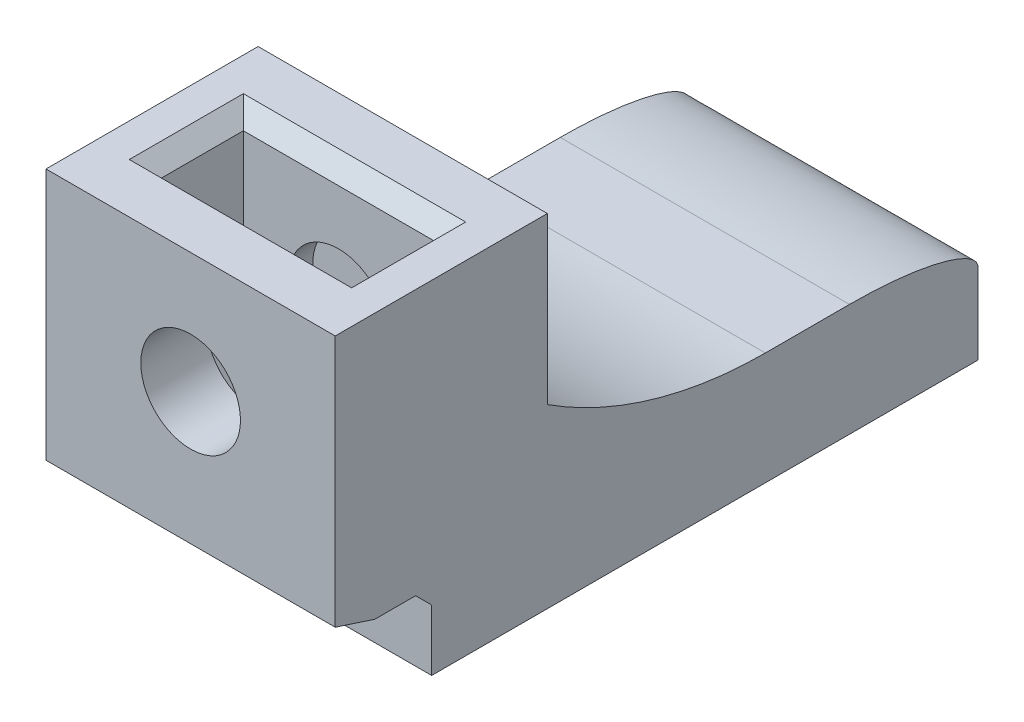
ISO-10303-21;
HEADER;
FILE_DESCRIPTION(('STEP AP214'),'2;1');
FILE_NAME('part.step','',(''),(''),'','','');
FILE_SCHEMA(('AUTOMOTIVE_DESIGN { 1 0 10303 214 1 1 1 1 }'));
ENDSEC;
DATA;
#1=APPLICATION_CONTEXT('core data for automotive mechanical design processes');
#2=APPLICATION_PROTOCOL_DEFINITION('international standard','automotive_design',2000,#1);
#3=PRODUCT_CONTEXT('',#1,'mechanical');
#4=PRODUCT('Part','Part','',(#3));
#5=PRODUCT_RELATED_PRODUCT_CATEGORY('part','',(#4));
#6=PRODUCT_DEFINITION_FORMATION('','',#4);
#7=PRODUCT_DEFINITION_CONTEXT('part definition',#1,'design');
#8=PRODUCT_DEFINITION('design','',#6,#7);
#9=PRODUCT_DEFINITION_SHAPE('','',#8);
#10=(LENGTH_UNIT() NAMED_UNIT(*) SI_UNIT(.MILLI.,.METRE.));
#11=(NAMED_UNIT(*) PLANE_ANGLE_UNIT() SI_UNIT($,.RADIAN.));
#12=(NAMED_UNIT(*) SI_UNIT($,.STERADIAN.) SOLID_ANGLE_UNIT());
#13=UNCERTAINTY_MEASURE_WITH_UNIT(LENGTH_MEASURE(1.E-05),#10,'distance_accuracy_value','');
#14=(GEOMETRIC_REPRESENTATION_CONTEXT(3) GLOBAL_UNCERTAINTY_ASSIGNED_CONTEXT((#13)) GLOBAL_UNIT_ASSIGNED_CONTEXT((#10,
#11,#12)) REPRESENTATION_CONTEXT('',''));
#15=CARTESIAN_POINT('',(0.,0.,0.));
#16=DIRECTION('',(0.,0.,1.));
#17=DIRECTION('',(1.,0.,0.));
#18=AXIS2_PLACEMENT_3D('',#15,#16,#17);
#19=CARTESIAN_POINT('',(9.,0.,0.));
#20=DIRECTION('',(0.,-1.,0.));
#21=DIRECTION('',(0.,0.,-1.));
#22=AXIS2_PLACEMENT_3D('',#19,#20,#21);
#23=PLANE('',#22);
#24=DIRECTION('',(1.,0.,0.));
#25=VECTOR('',#24,1.);
#26=CARTESIAN_POINT('',(9.,0.,-10.2));
#27=LINE('',#26,#25);
#28=CARTESIAN_POINT('',(-6.91784025919367,0.,-10.2));
#29=VERTEX_POINT('',#28);
#30=CARTESIAN_POINT('',(6.91784025919367,0.,-10.2));
#31=VERTEX_POINT('',#30);
#32=EDGE_CURVE('E414',#29,#31,#27,.T.);
#33=ORIENTED_EDGE('',*,*,#32,.T.);
#34=DIRECTION('',(0.,0.,1.));
#35=VECTOR('',#34,1.);
#36=CARTESIAN_POINT('',(6.91784025919367,0.,0.));
#37=LINE('',#36,#35);
#38=CARTESIAN_POINT('',(6.91784025919367,0.,-3.09999999999999));
#39=VERTEX_POINT('',#38);
#40=EDGE_CURVE('E416',#31,#39,#37,.T.);
#41=ORIENTED_EDGE('',*,*,#40,.T.);
#42=DIRECTION('',(-1.,0.,0.));
#43=VECTOR('',#42,1.);
#44=CARTESIAN_POINT('',(-5.91784025919367,0.,-3.09999999999999));
#45=LINE('',#44,#43);
#46=CARTESIAN_POINT('',(-6.91784025919367,0.,-3.09999999999999));
#47=VERTEX_POINT('',#46);
#48=EDGE_CURVE('E410',#39,#47,#45,.T.);
#49=ORIENTED_EDGE('',*,*,#48,.T.);
#50=DIRECTION('',(0.,0.,-1.));
#51=VECTOR('',#50,1.);
#52=CARTESIAN_POINT('',(-6.91784025919367,0.,0.));
#53=LINE('',#52,#51);
#54=EDGE_CURVE('E412',#47,#29,#53,.T.);
#55=ORIENTED_EDGE('',*,*,#54,.T.);
#56=EDGE_LOOP('',(#33,#41,#49,#55));
#57=FACE_BOUND('',#56,.T.);
#58=DIRECTION('',(0.,0.,1.));
#59=VECTOR('',#58,1.);
#60=CARTESIAN_POINT('',(-9.,0.,0.));
#61=LINE('',#60,#59);
#62=CARTESIAN_POINT('',(-9.,0.,-13.2));
#63=VERTEX_POINT('',#62);
#64=CARTESIAN_POINT('',(-9.,0.,0.));
#65=VERTEX_POINT('',#64);
#66=EDGE_CURVE('E361',#63,#65,#61,.T.);
#67=ORIENTED_EDGE('',*,*,#66,.T.);
#68=DIRECTION('',(-1.,0.,0.));
#69=VECTOR('',#68,1.);
#70=CARTESIAN_POINT('',(9.,0.,0.));
#71=LINE('',#70,#69);
#72=CARTESIAN_POINT('',(9.,0.,0.));
#73=VERTEX_POINT('',#72);
#74=EDGE_CURVE('E375',#73,#65,#71,.T.);
#75=ORIENTED_EDGE('',*,*,#74,.F.);
#76=DIRECTION('',(0.,0.,1.));
#77=VECTOR('',#76,1.);
#78=CARTESIAN_POINT('',(9.,0.,0.));
#79=LINE('',#78,#77);
#80=CARTESIAN_POINT('',(9.,0.,-13.2));
#81=VERTEX_POINT('',#80);
#82=EDGE_CURVE('E524',#81,#73,#79,.T.);
#83=ORIENTED_EDGE('',*,*,#82,.F.);
#84=DIRECTION('',(-1.,0.,0.));
#85=VECTOR('',#84,1.);
#86=CARTESIAN_POINT('',(9.,0.,-13.2));
#87=LINE('',#86,#85);
#88=EDGE_CURVE('E357',#81,#63,#87,.T.);
#89=ORIENTED_EDGE('',*,*,#88,.T.);
#90=EDGE_LOOP('',(#67,#75,#83,#89));
#91=FACE_BOUND('',#90,.T.);
#92=ADVANCED_FACE('F44',(#57,#91),#23,.F.);
#93=CARTESIAN_POINT('',(0.,-7.5,-21.9681240867132));
#94=DIRECTION('',(0.,0.,1.));
#95=DIRECTION('',(1.,0.,0.));
#96=AXIS2_PLACEMENT_3D('',#93,#94,#95);
#97=CYLINDRICAL_SURFACE('',#96,3.1);
#98=CARTESIAN_POINT('',(0.,-7.5,0.));
#99=DIRECTION('',(0.,0.,-1.));
#100=DIRECTION('',(-1.,0.,0.));
#101=AXIS2_PLACEMENT_3D('',#98,#99,#100);
#102=CIRCLE('',#101,3.1);
#103=CARTESIAN_POINT('',(-3.1,-7.5,0.));
#104=VERTEX_POINT('',#103);
#105=EDGE_CURVE('E240',#104,#104,#102,.T.);
#106=ORIENTED_EDGE('',*,*,#105,.F.);
#107=EDGE_LOOP('',(#106));
#108=FACE_BOUND('',#107,.T.);
#109=CARTESIAN_POINT('',(0.,-7.5,-4.1));
#110=DIRECTION('',(0.,0.,-1.));
#111=DIRECTION('',(-1.,0.,0.));
#112=AXIS2_PLACEMENT_3D('',#109,#110,#111);
#113=CIRCLE('',#112,3.1);
#114=CARTESIAN_POINT('',(-3.1,-7.5,-4.1));
#115=VERTEX_POINT('',#114);
#116=EDGE_CURVE('E244',#115,#115,#113,.T.);
#117=ORIENTED_EDGE('',*,*,#116,.T.);
#118=EDGE_LOOP('',(#117));
#119=FACE_BOUND('',#118,.T.);
#120=ADVANCED_FACE('F285',(#108,#119),#97,.F.);
#121=CARTESIAN_POINT('',(9.,-21.3,0.));
#122=DIRECTION('',(0.,1.,0.));
#123=DIRECTION('',(0.,0.,1.));
#124=AXIS2_PLACEMENT_3D('',#121,#122,#123);
#125=PLANE('',#124);
#126=DIRECTION('',(0.,0.,-1.));
#127=VECTOR('',#126,1.);
#128=CARTESIAN_POINT('',(-9.,-21.3,0.));
#129=LINE('',#128,#127);
#130=CARTESIAN_POINT('',(-9.,-21.3,-6.));
#131=VERTEX_POINT('',#130);
#132=CARTESIAN_POINT('',(-9.,-21.3,-40.));
#133=VERTEX_POINT('',#132);
#134=EDGE_CURVE('E247',#131,#133,#129,.T.);
#135=ORIENTED_EDGE('',*,*,#134,.T.);
#136=DIRECTION('',(-1.,0.,0.));
#137=VECTOR('',#136,1.);
#138=CARTESIAN_POINT('',(9.,-21.3,-40.));
#139=LINE('',#138,#137);
#140=CARTESIAN_POINT('',(9.,-21.3,-40.));
#141=VERTEX_POINT('',#140);
#142=EDGE_CURVE('E381',#141,#133,#139,.T.);
#143=ORIENTED_EDGE('',*,*,#142,.F.);
#144=DIRECTION('',(0.,0.,-1.));
#145=VECTOR('',#144,1.);
#146=CARTESIAN_POINT('',(9.,-21.3,0.));
#147=LINE('',#146,#145);
#148=CARTESIAN_POINT('',(9.,-21.3,-6.));
#149=VERTEX_POINT('',#148);
#150=EDGE_CURVE('E248',#149,#141,#147,.T.);
#151=ORIENTED_EDGE('',*,*,#150,.F.);
#152=DIRECTION('',(-1.,0.,0.));
#153=VECTOR('',#152,1.);
#154=CARTESIAN_POINT('',(9.,-21.3,-6.));
#155=LINE('',#154,#153);
#156=EDGE_CURVE('E372',#149,#131,#155,.T.);
#157=ORIENTED_EDGE('',*,*,#156,.T.);
#158=EDGE_LOOP('',(#135,#143,#151,#157));
#159=FACE_BOUND('',#158,.T.);
#160=ADVANCED_FACE('F280',(#159),#125,.F.);
#161=CARTESIAN_POINT('',(9.,0.,-40.));
#162=DIRECTION('',(0.,0.,1.));
#163=DIRECTION('',(1.,0.,0.));
#164=AXIS2_PLACEMENT_3D('',#161,#162,#163);
#165=PLANE('',#164);
#166=DIRECTION('',(0.,1.,0.));
#167=VECTOR('',#166,1.);
#168=CARTESIAN_POINT('',(-9.,0.,-40.));
#169=LINE('',#168,#167);
#170=CARTESIAN_POINT('',(-9.,-16.3,-40.));
#171=VERTEX_POINT('',#170);
#172=EDGE_CURVE('E435',#133,#171,#169,.T.);
#173=ORIENTED_EDGE('',*,*,#172,.T.);
#174=CARTESIAN_POINT('',(9.9,-16.3,-40.));
#175=CARTESIAN_POINT('',(3.3,-16.3,-40.));
#176=CARTESIAN_POINT('',(-3.3,-16.3,-40.));
#177=CARTESIAN_POINT('',(-9.9,-16.3,-40.));
#178=(BOUNDED_CURVE() B_SPLINE_CURVE(3,(#174,#175,#176,#177),.UNSPECIFIED.,.F.,
.F.) B_SPLINE_CURVE_WITH_KNOTS((4,4),(-0.0009,0.0189),
.UNSPECIFIED.) CURVE() GEOMETRIC_REPRESENTATION_ITEM() RATIONAL_B_SPLINE_CURVE((1.,1.,1.,1.)) REPRESENTATION_ITEM(''));
#179=CARTESIAN_POINT('',(9.,-16.3,-40.));
#180=VERTEX_POINT('',#179);
#181=EDGE_CURVE('E58',#171,#180,#178,.F.);
#182=ORIENTED_EDGE('',*,*,#181,.T.);
#183=DIRECTION('',(0.,1.,0.));
#184=VECTOR('',#183,1.);
#185=CARTESIAN_POINT('',(9.,0.,-40.));
#186=LINE('',#185,#184);
#187=EDGE_CURVE('E251',#141,#180,#186,.T.);
#188=ORIENTED_EDGE('',*,*,#187,.F.);
#189=ORIENTED_EDGE('',*,*,#142,.T.);
#190=EDGE_LOOP('',(#173,#182,#188,#189));
#191=FACE_BOUND('',#190,.T.);
#192=ADVANCED_FACE('F269',(#191),#165,.F.);
#193=CARTESIAN_POINT('',(9.,-14.3,0.));
#194=DIRECTION('',(0.,-1.,0.));
#195=DIRECTION('',(0.,0.,-1.));
#196=AXIS2_PLACEMENT_3D('',#193,#194,#195);
#197=PLANE('',#196);
#198=DIRECTION('',(0.,0.,1.));
#199=VECTOR('',#198,1.);
#200=CARTESIAN_POINT('',(9.,-14.3,0.));
#201=LINE('',#200,#199);
#202=CARTESIAN_POINT('',(9.,-14.3,-32.));
#203=VERTEX_POINT('',#202);
#204=CARTESIAN_POINT('',(9.,-14.3,-26.7646599662505));
#205=VERTEX_POINT('',#204);
#206=EDGE_CURVE('E259',#203,#205,#201,.T.);
#207=ORIENTED_EDGE('',*,*,#206,.F.);
#208=CARTESIAN_POINT('',(-9.9,-14.3,-32.));
#209=CARTESIAN_POINT('',(-3.3,-14.3,-32.));
#210=CARTESIAN_POINT('',(3.3,-14.3,-32.));
#211=CARTESIAN_POINT('',(9.9,-14.3,-32.));
#212=(BOUNDED_CURVE() B_SPLINE_CURVE(3,(#208,#209,#210,#211),.UNSPECIFIED.,.F.,
.F.) B_SPLINE_CURVE_WITH_KNOTS((4,4),(-0.000900000000000001,0.0189),
.UNSPECIFIED.) CURVE() GEOMETRIC_REPRESENTATION_ITEM() RATIONAL_B_SPLINE_CURVE((1.,1.,1.,1.)) REPRESENTATION_ITEM(''));
#213=CARTESIAN_POINT('',(-9.,-14.3,-32.));
#214=VERTEX_POINT('',#213);
#215=EDGE_CURVE('E424',#203,#214,#212,.F.);
#216=ORIENTED_EDGE('',*,*,#215,.T.);
#217=DIRECTION('',(0.,0.,1.));
#218=VECTOR('',#217,1.);
#219=CARTESIAN_POINT('',(-9.,-14.3,0.));
#220=LINE('',#219,#218);
#221=CARTESIAN_POINT('',(-9.,-14.3,-26.7646599662505));
#222=VERTEX_POINT('',#221);
#223=EDGE_CURVE('E352',#214,#222,#220,.T.);
#224=ORIENTED_EDGE('',*,*,#223,.T.);
#225=DIRECTION('',(-1.,0.,0.));
#226=VECTOR('',#225,1.);
#227=CARTESIAN_POINT('',(9.,-14.3,-26.7646599662505));
#228=LINE('',#227,#226);
#229=EDGE_CURVE('E349',#205,#222,#228,.T.);
#230=ORIENTED_EDGE('',*,*,#229,.F.);
#231=EDGE_LOOP('',(#207,#216,#224,#230));
#232=FACE_BOUND('',#231,.T.);
#233=ADVANCED_FACE('F279',(#232),#197,.F.);
#234=CARTESIAN_POINT('',(9.,10.7,-26.7646599662505));
#235=DIRECTION('',(-1.,0.,0.));
#236=DIRECTION('',(0.,0.,1.));
#237=AXIS2_PLACEMENT_3D('',#234,#235,#236);
#238=CYLINDRICAL_SURFACE('',#237,25.);
#239=CARTESIAN_POINT('',(-9.,10.7,-26.7646599662505));
#240=DIRECTION('',(1.,0.,0.));
#241=DIRECTION('',(0.,0.,-1.));
#242=AXIS2_PLACEMENT_3D('',#239,#240,#241);
#243=CIRCLE('',#242,25.);
#244=CARTESIAN_POINT('',(-9.,-10.3,-13.2));
#245=VERTEX_POINT('',#244);
#246=EDGE_CURVE('E343',#222,#245,#243,.F.);
#247=ORIENTED_EDGE('',*,*,#246,.T.);
#248=DIRECTION('',(-1.,0.,0.));
#249=VECTOR('',#248,1.);
#250=CARTESIAN_POINT('',(9.,-10.3,-13.2));
#251=LINE('',#250,#249);
#252=CARTESIAN_POINT('',(9.,-10.3,-13.2));
#253=VERTEX_POINT('',#252);
#254=EDGE_CURVE('E346',#253,#245,#251,.T.);
#255=ORIENTED_EDGE('',*,*,#254,.F.);
#256=CARTESIAN_POINT('',(9.,10.7,-26.7646599662505));
#257=DIRECTION('',(1.,0.,0.));
#258=DIRECTION('',(0.,0.,-1.));
#259=AXIS2_PLACEMENT_3D('',#256,#257,#258);
#260=CIRCLE('',#259,25.);
#261=EDGE_CURVE('E527',#205,#253,#260,.F.);
#262=ORIENTED_EDGE('',*,*,#261,.F.);
#263=ORIENTED_EDGE('',*,*,#229,.T.);
#264=EDGE_LOOP('',(#247,#255,#262,#263));
#265=FACE_BOUND('',#264,.T.);
#266=ADVANCED_FACE('F332',(#265),#238,.F.);
#267=CARTESIAN_POINT('',(9.,0.,-13.2));
#268=DIRECTION('',(0.,0.,1.));
#269=DIRECTION('',(1.,0.,0.));
#270=AXIS2_PLACEMENT_3D('',#267,#268,#269);
#271=PLANE('',#270);
#272=DIRECTION('',(0.,1.,0.));
#273=VECTOR('',#272,1.);
#274=CARTESIAN_POINT('',(-9.,0.,-13.2));
#275=LINE('',#274,#273);
#276=EDGE_CURVE('E351',#245,#63,#275,.T.);
#277=ORIENTED_EDGE('',*,*,#276,.T.);
#278=ORIENTED_EDGE('',*,*,#88,.F.);
#279=DIRECTION('',(0.,1.,0.));
#280=VECTOR('',#279,1.);
#281=CARTESIAN_POINT('',(9.,0.,-13.2));
#282=LINE('',#281,#280);
#283=EDGE_CURVE('E356',#253,#81,#282,.T.);
#284=ORIENTED_EDGE('',*,*,#283,.F.);
#285=ORIENTED_EDGE('',*,*,#254,.T.);
#286=EDGE_LOOP('',(#277,#278,#284,#285));
#287=FACE_BOUND('',#286,.T.);
#288=ADVANCED_FACE('F330',(#287),#271,.F.);
#289=CARTESIAN_POINT('',(9.,0.,0.));
#290=DIRECTION('',(0.,0.,-1.));
#291=DIRECTION('',(-1.,0.,0.));
#292=AXIS2_PLACEMENT_3D('',#289,#290,#291);
#293=PLANE('',#292);
#294=ORIENTED_EDGE('',*,*,#105,.T.);
#295=EDGE_LOOP('',(#294));
#296=FACE_BOUND('',#295,.T.);
#297=DIRECTION('',(0.,-1.,0.));
#298=VECTOR('',#297,1.);
#299=CARTESIAN_POINT('',(-9.,0.,0.));
#300=LINE('',#299,#298);
#301=CARTESIAN_POINT('',(-9.,-15.7,0.));
#302=VERTEX_POINT('',#301);
#303=EDGE_CURVE('E363',#65,#302,#300,.T.);
#304=ORIENTED_EDGE('',*,*,#303,.T.);
#305=DIRECTION('',(1.,0.,0.));
#306=VECTOR('',#305,1.);
#307=CARTESIAN_POINT('',(9.,-15.7,0.));
#308=LINE('',#307,#306);
#309=CARTESIAN_POINT('',(9.,-15.7,0.));
#310=VERTEX_POINT('',#309);
#311=EDGE_CURVE('E400',#302,#310,#308,.T.);
#312=ORIENTED_EDGE('',*,*,#311,.T.);
#313=DIRECTION('',(0.,-1.,0.));
#314=VECTOR('',#313,1.);
#315=CARTESIAN_POINT('',(9.,0.,0.));
#316=LINE('',#315,#314);
#317=EDGE_CURVE('E515',#73,#310,#316,.T.);
#318=ORIENTED_EDGE('',*,*,#317,.F.);
#319=ORIENTED_EDGE('',*,*,#74,.T.);
#320=EDGE_LOOP('',(#304,#312,#318,#319));
#321=FACE_BOUND('',#320,.T.);
#322=ADVANCED_FACE('F328',(#296,#321),#293,.F.);
#323=CARTESIAN_POINT('',(9.,-16.5,0.));
#324=DIRECTION('',(0.,1.,0.));
#325=DIRECTION('',(0.,0.,1.));
#326=AXIS2_PLACEMENT_3D('',#323,#324,#325);
#327=PLANE('',#326);
#328=DIRECTION('',(0.,0.,-1.));
#329=VECTOR('',#328,1.);
#330=CARTESIAN_POINT('',(9.,-16.5,0.));
#331=LINE('',#330,#329);
#332=CARTESIAN_POINT('',(9.,-16.5,-2.46214682974018));
#333=VERTEX_POINT('',#332);
#334=CARTESIAN_POINT('',(9.,-16.5,-4.99999999999999));
#335=VERTEX_POINT('',#334);
#336=EDGE_CURVE('E510',#333,#335,#331,.T.);
#337=ORIENTED_EDGE('',*,*,#336,.F.);
#338=DIRECTION('',(-1.,0.,0.));
#339=VECTOR('',#338,1.);
#340=CARTESIAN_POINT('',(9.,-16.5,-2.46214682974018));
#341=LINE('',#340,#339);
#342=CARTESIAN_POINT('',(-9.,-16.5,-2.46214682974018));
#343=VERTEX_POINT('',#342);
#344=EDGE_CURVE('E395',#333,#343,#341,.T.);
#345=ORIENTED_EDGE('',*,*,#344,.T.);
#346=DIRECTION('',(0.,0.,-1.));
#347=VECTOR('',#346,1.);
#348=CARTESIAN_POINT('',(-9.,-16.5,0.));
#349=LINE('',#348,#347);
#350=CARTESIAN_POINT('',(-9.,-16.5,-4.99999999999999));
#351=VERTEX_POINT('',#350);
#352=EDGE_CURVE('E369',#343,#351,#349,.T.);
#353=ORIENTED_EDGE('',*,*,#352,.T.);
#354=DIRECTION('',(1.,0.,0.));
#355=VECTOR('',#354,1.);
#356=CARTESIAN_POINT('',(9.,-16.5,-4.99999999999999));
#357=LINE('',#356,#355);
#358=EDGE_CURVE('E387',#351,#335,#357,.T.);
#359=ORIENTED_EDGE('',*,*,#358,.T.);
#360=EDGE_LOOP('',(#337,#345,#353,#359));
#361=FACE_BOUND('',#360,.T.);
#362=ADVANCED_FACE('F501',(#361),#327,.F.);
#363=CARTESIAN_POINT('',(9.,0.,-6.));
#364=DIRECTION('',(0.,0.,-1.));
#365=DIRECTION('',(-1.,0.,0.));
#366=AXIS2_PLACEMENT_3D('',#363,#364,#365);
#367=PLANE('',#366);
#368=DIRECTION('',(0.,-1.,0.));
#369=VECTOR('',#368,1.);
#370=CARTESIAN_POINT('',(9.,0.,-6.));
#371=LINE('',#370,#369);
#372=CARTESIAN_POINT('',(9.,-17.5,-6.));
#373=VERTEX_POINT('',#372);
#374=EDGE_CURVE('E376',#373,#149,#371,.T.);
#375=ORIENTED_EDGE('',*,*,#374,.F.);
#376=DIRECTION('',(-1.,0.,0.));
#377=VECTOR('',#376,1.);
#378=CARTESIAN_POINT('',(-9.,-17.5,-6.));
#379=LINE('',#378,#377);
#380=CARTESIAN_POINT('',(-9.,-17.5,-6.));
#381=VERTEX_POINT('',#380);
#382=EDGE_CURVE('E384',#373,#381,#379,.T.);
#383=ORIENTED_EDGE('',*,*,#382,.T.);
#384=DIRECTION('',(0.,-1.,0.));
#385=VECTOR('',#384,1.);
#386=CARTESIAN_POINT('',(-9.,0.,-6.));
#387=LINE('',#386,#385);
#388=EDGE_CURVE('E252',#381,#131,#387,.T.);
#389=ORIENTED_EDGE('',*,*,#388,.T.);
#390=ORIENTED_EDGE('',*,*,#156,.F.);
#391=EDGE_LOOP('',(#375,#383,#389,#390));
#392=FACE_BOUND('',#391,.T.);
#393=ADVANCED_FACE('F494',(#392),#367,.F.);
#394=CARTESIAN_POINT('',(9.,0.,0.));
#395=DIRECTION('',(1.,0.,0.));
#396=DIRECTION('',(0.,0.,-1.));
#397=AXIS2_PLACEMENT_3D('',#394,#395,#396);
#398=PLANE('',#397);
#399=ORIENTED_EDGE('',*,*,#187,.T.);
#400=CARTESIAN_POINT('',(9.,-14.3,-32.));
#401=CARTESIAN_POINT('',(9.,-14.3,-40.));
#402=CARTESIAN_POINT('',(9.,-16.3,-40.));
#403=(BOUNDED_CURVE() B_SPLINE_CURVE(2,(#400,#401,#402),.UNSPECIFIED.,.F.,
.F.) B_SPLINE_CURVE_WITH_KNOTS((3,3),(0.,1.),
.UNSPECIFIED.) CURVE() GEOMETRIC_REPRESENTATION_ITEM() RATIONAL_B_SPLINE_CURVE((1.,
0.707106781186548,1.)) REPRESENTATION_ITEM(''));
#404=EDGE_CURVE('E13',#180,#203,#403,.F.);
#405=ORIENTED_EDGE('',*,*,#404,.T.);
#406=ORIENTED_EDGE('',*,*,#206,.T.);
#407=ORIENTED_EDGE('',*,*,#261,.T.);
#408=ORIENTED_EDGE('',*,*,#283,.T.);
#409=ORIENTED_EDGE('',*,*,#82,.T.);
#410=ORIENTED_EDGE('',*,*,#317,.T.);
#411=DIRECTION('',(0.,0.309016994374949,0.951056516295153));
#412=VECTOR('',#411,1.);
#413=CARTESIAN_POINT('',(9.,-14.2007834058433,4.61411423049594));
#414=LINE('',#413,#412);
#415=EDGE_CURVE('E402',#310,#333,#414,.F.);
#416=ORIENTED_EDGE('',*,*,#415,.T.);
#417=ORIENTED_EDGE('',*,*,#336,.T.);
#418=DIRECTION('',(0.,0.70710678118655,0.707106781186545));
#419=VECTOR('',#418,1.);
#420=CARTESIAN_POINT('',(9.,-17.5,-6.));
#421=LINE('',#420,#419);
#422=EDGE_CURVE('E393',#335,#373,#421,.F.);
#423=ORIENTED_EDGE('',*,*,#422,.T.);
#424=ORIENTED_EDGE('',*,*,#374,.T.);
#425=ORIENTED_EDGE('',*,*,#150,.T.);
#426=EDGE_LOOP('',(#399,#405,#406,#407,#408,#409,#410,#416,#417,#423,#424,#425));
#427=FACE_BOUND('',#426,.T.);
#428=ADVANCED_FACE('F486',(#427),#398,.T.);
#429=CARTESIAN_POINT('',(-9.,0.,0.));
#430=DIRECTION('',(1.,0.,0.));
#431=DIRECTION('',(0.,0.,-1.));
#432=AXIS2_PLACEMENT_3D('',#429,#430,#431);
#433=PLANE('',#432);
#434=ORIENTED_EDGE('',*,*,#223,.F.);
#435=CARTESIAN_POINT('',(-9.,-16.3,-40.));
#436=CARTESIAN_POINT('',(-9.,-14.3,-40.));
#437=CARTESIAN_POINT('',(-9.,-14.3,-32.));
#438=(BOUNDED_CURVE() B_SPLINE_CURVE(2,(#435,#436,#437),.UNSPECIFIED.,.F.,
.F.) B_SPLINE_CURVE_WITH_KNOTS((3,3),(0.,1.),
.UNSPECIFIED.) CURVE() GEOMETRIC_REPRESENTATION_ITEM() RATIONAL_B_SPLINE_CURVE((1.,
0.707106781186548,1.)) REPRESENTATION_ITEM(''));
#439=EDGE_CURVE('E73',#214,#171,#438,.F.);
#440=ORIENTED_EDGE('',*,*,#439,.T.);
#441=ORIENTED_EDGE('',*,*,#172,.F.);
#442=ORIENTED_EDGE('',*,*,#134,.F.);
#443=ORIENTED_EDGE('',*,*,#388,.F.);
#444=DIRECTION('',(0.,-0.70710678118655,-0.707106781186545));
#445=VECTOR('',#444,1.);
#446=CARTESIAN_POINT('',(-9.,-5.74999999999995,5.74999999999999));
#447=LINE('',#446,#445);
#448=EDGE_CURVE('E390',#381,#351,#447,.F.);
#449=ORIENTED_EDGE('',*,*,#448,.T.);
#450=ORIENTED_EDGE('',*,*,#352,.F.);
#451=DIRECTION('',(0.,-0.309016994374949,-0.951056516295153));
#452=VECTOR('',#451,1.);
#453=CARTESIAN_POINT('',(-9.,-16.5,-2.46214682974018));
#454=LINE('',#453,#452);
#455=EDGE_CURVE('E398',#343,#302,#454,.F.);
#456=ORIENTED_EDGE('',*,*,#455,.T.);
#457=ORIENTED_EDGE('',*,*,#303,.F.);
#458=ORIENTED_EDGE('',*,*,#66,.F.);
#459=ORIENTED_EDGE('',*,*,#276,.F.);
#460=ORIENTED_EDGE('',*,*,#246,.F.);
#461=EDGE_LOOP('',(#434,#440,#441,#442,#443,#449,#450,#456,#457,#458,#459,#460));
#462=FACE_BOUND('',#461,.T.);
#463=ADVANCED_FACE('F291',(#462),#433,.F.);
#464=CARTESIAN_POINT('',(9.,-17.5,-6.));
#465=DIRECTION('',(0.,-0.707106781186545,0.70710678118655));
#466=DIRECTION('',(1.,0.,0.));
#467=AXIS2_PLACEMENT_3D('',#464,#465,#466);
#468=PLANE('',#467);
#469=ORIENTED_EDGE('',*,*,#422,.F.);
#470=ORIENTED_EDGE('',*,*,#358,.F.);
#471=ORIENTED_EDGE('',*,*,#448,.F.);
#472=ORIENTED_EDGE('',*,*,#382,.F.);
#473=EDGE_LOOP('',(#469,#470,#471,#472));
#474=FACE_BOUND('',#473,.T.);
#475=ADVANCED_FACE('F287',(#474),#468,.T.);
#476=CARTESIAN_POINT('',(9.,-16.5,-2.46214682974018));
#477=DIRECTION('',(0.,0.951056516295153,-0.309016994374949));
#478=DIRECTION('',(-1.,0.,0.));
#479=AXIS2_PLACEMENT_3D('',#476,#477,#478);
#480=PLANE('',#479);
#481=ORIENTED_EDGE('',*,*,#415,.F.);
#482=ORIENTED_EDGE('',*,*,#311,.F.);
#483=ORIENTED_EDGE('',*,*,#455,.F.);
#484=ORIENTED_EDGE('',*,*,#344,.F.);
#485=EDGE_LOOP('',(#481,#482,#483,#484));
#486=FACE_BOUND('',#485,.T.);
#487=ADVANCED_FACE('F290',(#486),#480,.F.);
#488=CARTESIAN_POINT('',(5.91784025919367,0.,-4.1));
#489=DIRECTION('',(1.,0.,0.));
#490=DIRECTION('',(0.,1.,0.));
#491=AXIS2_PLACEMENT_3D('',#488,#489,#490);
#492=PLANE('',#491);
#493=DIRECTION('',(0.,-1.,0.));
#494=VECTOR('',#493,1.);
#495=CARTESIAN_POINT('',(5.91784025919367,0.,-4.1));
#496=LINE('',#495,#494);
#497=CARTESIAN_POINT('',(5.91784025919367,-1.,-4.1));
#498=VERTEX_POINT('',#497);
#499=CARTESIAN_POINT('',(5.91784025919367,-7.5,-4.1));
#500=VERTEX_POINT('',#499);
#501=EDGE_CURVE('E187',#498,#500,#496,.T.);
#502=ORIENTED_EDGE('',*,*,#501,.F.);
#503=DIRECTION('',(0.,0.,-1.));
#504=VECTOR('',#503,1.);
#505=CARTESIAN_POINT('',(5.91784025919367,-1.,-4.1));
#506=LINE('',#505,#504);
#507=CARTESIAN_POINT('',(5.91784025919367,-1.,-9.2));
#508=VERTEX_POINT('',#507);
#509=EDGE_CURVE('E404',#498,#508,#506,.T.);
#510=ORIENTED_EDGE('',*,*,#509,.T.);
#511=DIRECTION('',(0.,-1.,0.));
#512=VECTOR('',#511,1.);
#513=CARTESIAN_POINT('',(5.91784025919367,0.,-9.2));
#514=LINE('',#513,#512);
#515=CARTESIAN_POINT('',(5.91784025919367,-7.5,-9.2));
#516=VERTEX_POINT('',#515);
#517=EDGE_CURVE('E205',#508,#516,#514,.T.);
#518=ORIENTED_EDGE('',*,*,#517,.T.);
#519=DIRECTION('',(0.,0.,-1.));
#520=VECTOR('',#519,1.);
#521=CARTESIAN_POINT('',(5.91784025919367,-7.5,-4.1));
#522=LINE('',#521,#520);
#523=EDGE_CURVE('E202',#500,#516,#522,.T.);
#524=ORIENTED_EDGE('',*,*,#523,.F.);
#525=EDGE_LOOP('',(#502,#510,#518,#524));
#526=FACE_BOUND('',#525,.T.);
#527=ADVANCED_FACE('F203',(#526),#492,.F.);
#528=CARTESIAN_POINT('',(-5.91784025919367,0.,-4.1));
#529=DIRECTION('',(-1.,0.,0.));
#530=DIRECTION('',(0.,-1.,0.));
#531=AXIS2_PLACEMENT_3D('',#528,#529,#530);
#532=PLANE('',#531);
#533=DIRECTION('',(0.,1.,0.));
#534=VECTOR('',#533,1.);
#535=CARTESIAN_POINT('',(-5.91784025919367,0.,-9.2));
#536=LINE('',#535,#534);
#537=CARTESIAN_POINT('',(-5.91784025919367,-7.5,-9.2));
#538=VERTEX_POINT('',#537);
#539=CARTESIAN_POINT('',(-5.91784025919367,-1.,-9.2));
#540=VERTEX_POINT('',#539);
#541=EDGE_CURVE('E199',#538,#540,#536,.T.);
#542=ORIENTED_EDGE('',*,*,#541,.T.);
#543=DIRECTION('',(0.,0.,1.));
#544=VECTOR('',#543,1.);
#545=CARTESIAN_POINT('',(-5.91784025919367,-1.,-4.1));
#546=LINE('',#545,#544);
#547=CARTESIAN_POINT('',(-5.91784025919367,-1.,-4.1));
#548=VERTEX_POINT('',#547);
#549=EDGE_CURVE('E421',#540,#548,#546,.T.);
#550=ORIENTED_EDGE('',*,*,#549,.T.);
#551=DIRECTION('',(0.,1.,0.));
#552=VECTOR('',#551,1.);
#553=CARTESIAN_POINT('',(-5.91784025919367,0.,-4.1));
#554=LINE('',#553,#552);
#555=CARTESIAN_POINT('',(-5.91784025919367,-7.5,-4.1));
#556=VERTEX_POINT('',#555);
#557=EDGE_CURVE('E210',#556,#548,#554,.T.);
#558=ORIENTED_EDGE('',*,*,#557,.F.);
#559=DIRECTION('',(0.,0.,-1.));
#560=VECTOR('',#559,1.);
#561=CARTESIAN_POINT('',(-5.91784025919367,-7.5,-4.1));
#562=LINE('',#561,#560);
#563=EDGE_CURVE('E234',#556,#538,#562,.T.);
#564=ORIENTED_EDGE('',*,*,#563,.T.);
#565=EDGE_LOOP('',(#542,#550,#558,#564));
#566=FACE_BOUND('',#565,.T.);
#567=ADVANCED_FACE('F555',(#566),#532,.F.);
#568=CARTESIAN_POINT('',(-7.6859754585869,-4.4375,-4.1));
#569=DIRECTION('',(-0.866025403784439,-0.5,0.));
#570=DIRECTION('',(0.5,-0.866025403784439,0.));
#571=AXIS2_PLACEMENT_3D('',#568,#569,#570);
#572=PLANE('',#571);
#573=DIRECTION('',(-0.5,0.866025403784439,0.));
#574=VECTOR('',#573,1.);
#575=CARTESIAN_POINT('',(-7.6859754585869,-4.4375,-9.2));
#576=LINE('',#575,#574);
#577=CARTESIAN_POINT('',(-2.95892012959683,-12.625,-9.2));
#578=VERTEX_POINT('',#577);
#579=EDGE_CURVE('E229',#578,#538,#576,.T.);
#580=ORIENTED_EDGE('',*,*,#579,.T.);
#581=ORIENTED_EDGE('',*,*,#563,.F.);
#582=DIRECTION('',(-0.5,0.866025403784439,0.));
#583=VECTOR('',#582,1.);
#584=CARTESIAN_POINT('',(-7.6859754585869,-4.4375,-4.1));
#585=LINE('',#584,#583);
#586=CARTESIAN_POINT('',(-2.95892012959683,-12.625,-4.1));
#587=VERTEX_POINT('',#586);
#588=EDGE_CURVE('E216',#587,#556,#585,.T.);
#589=ORIENTED_EDGE('',*,*,#588,.F.);
#590=DIRECTION('',(0.,0.,-1.));
#591=VECTOR('',#590,1.);
#592=CARTESIAN_POINT('',(-2.95892012959683,-12.625,-4.1));
#593=LINE('',#592,#591);
#594=EDGE_CURVE('E237',#587,#578,#593,.T.);
#595=ORIENTED_EDGE('',*,*,#594,.T.);
#596=EDGE_LOOP('',(#580,#581,#589,#595));
#597=FACE_BOUND('',#596,.T.);
#598=ADVANCED_FACE('F558',(#597),#572,.F.);
#599=CARTESIAN_POINT('',(0.,-12.625,-4.1));
#600=DIRECTION('',(0.,-1.,0.));
#601=DIRECTION('',(0.,0.,-1.));
#602=AXIS2_PLACEMENT_3D('',#599,#600,#601);
#603=PLANE('',#602);
#604=DIRECTION('',(-1.,0.,0.));
#605=VECTOR('',#604,1.);
#606=CARTESIAN_POINT('',(0.,-12.625,-9.2));
#607=LINE('',#606,#605);
#608=CARTESIAN_POINT('',(2.95892012959684,-12.625,-9.2));
#609=VERTEX_POINT('',#608);
#610=EDGE_CURVE('E226',#609,#578,#607,.T.);
#611=ORIENTED_EDGE('',*,*,#610,.T.);
#612=ORIENTED_EDGE('',*,*,#594,.F.);
#613=DIRECTION('',(-1.,0.,0.));
#614=VECTOR('',#613,1.);
#615=CARTESIAN_POINT('',(0.,-12.625,-4.1));
#616=LINE('',#615,#614);
#617=CARTESIAN_POINT('',(2.95892012959684,-12.625,-4.1));
#618=VERTEX_POINT('',#617);
#619=EDGE_CURVE('E214',#618,#587,#616,.T.);
#620=ORIENTED_EDGE('',*,*,#619,.F.);
#621=DIRECTION('',(0.,0.,-1.));
#622=VECTOR('',#621,1.);
#623=CARTESIAN_POINT('',(2.95892012959684,-12.625,-4.1));
#624=LINE('',#623,#622);
#625=EDGE_CURVE('E209',#618,#609,#624,.T.);
#626=ORIENTED_EDGE('',*,*,#625,.T.);
#627=EDGE_LOOP('',(#611,#612,#620,#626));
#628=FACE_BOUND('',#627,.T.);
#629=ADVANCED_FACE('F552',(#628),#603,.F.);
#630=CARTESIAN_POINT('',(7.68597545858689,-4.43749999999999,-4.1));
#631=DIRECTION('',(0.866025403784439,-0.5,0.));
#632=DIRECTION('',(0.5,0.866025403784439,0.));
#633=AXIS2_PLACEMENT_3D('',#630,#631,#632);
#634=PLANE('',#633);
#635=DIRECTION('',(-0.5,-0.866025403784439,0.));
#636=VECTOR('',#635,1.);
#637=CARTESIAN_POINT('',(7.68597545858689,-4.43749999999999,-9.2));
#638=LINE('',#637,#636);
#639=EDGE_CURVE('E223',#516,#609,#638,.T.);
#640=ORIENTED_EDGE('',*,*,#639,.T.);
#641=ORIENTED_EDGE('',*,*,#625,.F.);
#642=DIRECTION('',(-0.5,-0.866025403784439,0.));
#643=VECTOR('',#642,1.);
#644=CARTESIAN_POINT('',(7.68597545858689,-4.43749999999999,-4.1));
#645=LINE('',#644,#643);
#646=EDGE_CURVE('E193',#500,#618,#645,.T.);
#647=ORIENTED_EDGE('',*,*,#646,.F.);
#648=ORIENTED_EDGE('',*,*,#523,.T.);
#649=EDGE_LOOP('',(#640,#641,#647,#648));
#650=FACE_BOUND('',#649,.T.);
#651=ADVANCED_FACE('F212',(#650),#634,.F.);
#652=CARTESIAN_POINT('',(0.,0.,-4.1));
#653=DIRECTION('',(0.,0.,-1.));
#654=DIRECTION('',(-1.,0.,0.));
#655=AXIS2_PLACEMENT_3D('',#652,#653,#654);
#656=PLANE('',#655);
#657=ORIENTED_EDGE('',*,*,#116,.F.);
#658=EDGE_LOOP('',(#657));
#659=FACE_BOUND('',#658,.T.);
#660=ORIENTED_EDGE('',*,*,#557,.T.);
#661=DIRECTION('',(1.,0.,0.));
#662=VECTOR('',#661,1.);
#663=CARTESIAN_POINT('',(5.91784025919367,-1.,-4.1));
#664=LINE('',#663,#662);
#665=EDGE_CURVE('E195',#548,#498,#664,.T.);
#666=ORIENTED_EDGE('',*,*,#665,.T.);
#667=ORIENTED_EDGE('',*,*,#501,.T.);
#668=ORIENTED_EDGE('',*,*,#646,.T.);
#669=ORIENTED_EDGE('',*,*,#619,.T.);
#670=ORIENTED_EDGE('',*,*,#588,.T.);
#671=EDGE_LOOP('',(#660,#666,#667,#668,#669,#670));
#672=FACE_BOUND('',#671,.T.);
#673=ADVANCED_FACE('F190',(#659,#672),#656,.T.);
#674=CARTESIAN_POINT('',(0.,0.,-9.2));
#675=DIRECTION('',(0.,0.,-1.));
#676=DIRECTION('',(-1.,0.,0.));
#677=AXIS2_PLACEMENT_3D('',#674,#675,#676);
#678=PLANE('',#677);
#679=CARTESIAN_POINT('',(0.,-7.5,-9.2));
#680=DIRECTION('',(0.,0.,-1.));
#681=DIRECTION('',(-1.,0.,0.));
#682=AXIS2_PLACEMENT_3D('',#679,#680,#681);
#683=CIRCLE('',#682,3.1);
#684=CARTESIAN_POINT('',(-3.1,-7.5,-9.2));
#685=VERTEX_POINT('',#684);
#686=EDGE_CURVE('E236',#685,#685,#683,.T.);
#687=ORIENTED_EDGE('',*,*,#686,.T.);
#688=EDGE_LOOP('',(#687));
#689=FACE_BOUND('',#688,.T.);
#690=ORIENTED_EDGE('',*,*,#517,.F.);
#691=DIRECTION('',(-1.,0.,0.));
#692=VECTOR('',#691,1.);
#693=CARTESIAN_POINT('',(0.,-1.,-9.2));
#694=LINE('',#693,#692);
#695=EDGE_CURVE('E419',#508,#540,#694,.T.);
#696=ORIENTED_EDGE('',*,*,#695,.T.);
#697=ORIENTED_EDGE('',*,*,#541,.F.);
#698=ORIENTED_EDGE('',*,*,#579,.F.);
#699=ORIENTED_EDGE('',*,*,#610,.F.);
#700=ORIENTED_EDGE('',*,*,#639,.F.);
#701=EDGE_LOOP('',(#690,#696,#697,#698,#699,#700));
#702=FACE_BOUND('',#701,.T.);
#703=ADVANCED_FACE('F544',(#689,#702),#678,.F.);
#704=CARTESIAN_POINT('',(9.,0.,-10.7));
#705=DIRECTION('',(0.,0.,1.));
#706=DIRECTION('',(1.,0.,0.));
#707=AXIS2_PLACEMENT_3D('',#704,#705,#706);
#708=PLANE('',#707);
#709=CARTESIAN_POINT('',(0.,-7.5,-10.7));
#710=DIRECTION('',(0.,0.,1.));
#711=DIRECTION('',(1.,0.,0.));
#712=AXIS2_PLACEMENT_3D('',#709,#710,#711);
#713=CIRCLE('',#712,3.1);
#714=CARTESIAN_POINT('',(3.1,-7.5,-10.7));
#715=VERTEX_POINT('',#714);
#716=EDGE_CURVE('E243',#715,#715,#713,.T.);
#717=ORIENTED_EDGE('',*,*,#716,.T.);
#718=EDGE_LOOP('',(#717));
#719=FACE_BOUND('',#718,.T.);
#720=ADVANCED_FACE('F314',(#719),#708,.T.);
#721=ORIENTED_EDGE('',*,*,#686,.F.);
#722=EDGE_LOOP('',(#721));
#723=FACE_BOUND('',#722,.T.);
#724=ORIENTED_EDGE('',*,*,#716,.F.);
#725=EDGE_LOOP('',(#724));
#726=FACE_BOUND('',#725,.T.);
#727=ADVANCED_FACE('F309',(#723,#726),#97,.F.);
#728=CARTESIAN_POINT('',(-6.91784025919367,0.,0.));
#729=DIRECTION('',(-0.707106781186545,-0.70710678118655,0.));
#730=DIRECTION('',(0.,0.,-1.));
#731=AXIS2_PLACEMENT_3D('',#728,#729,#730);
#732=PLANE('',#731);
#733=DIRECTION('',(-0.577350269189627,0.577350269189623,-0.577350269189627));
#734=VECTOR('',#733,1.);
#735=CARTESIAN_POINT('',(-1.61189350612909,-5.30594675306455,-4.89405324693543));
#736=LINE('',#735,#734);
#737=EDGE_CURVE('E429',#29,#540,#736,.F.);
#738=ORIENTED_EDGE('',*,*,#737,.F.);
#739=ORIENTED_EDGE('',*,*,#54,.F.);
#740=DIRECTION('',(0.577350269189627,-0.577350269189623,-0.577350269189627));
#741=VECTOR('',#740,1.);
#742=CARTESIAN_POINT('',(-7.95117359252701,1.03333333333333,-2.06666666666666));
#743=LINE('',#742,#741);
#744=EDGE_CURVE('E224',#548,#47,#743,.F.);
#745=ORIENTED_EDGE('',*,*,#744,.F.);
#746=ORIENTED_EDGE('',*,*,#549,.F.);
#747=EDGE_LOOP('',(#738,#739,#745,#746));
#748=FACE_BOUND('',#747,.T.);
#749=ADVANCED_FACE('F306',(#748),#732,.F.);
#750=CARTESIAN_POINT('',(0.,-1.,-4.1));
#751=DIRECTION('',(0.,0.70710678118655,-0.707106781186545));
#752=DIRECTION('',(-1.,0.,0.));
#753=AXIS2_PLACEMENT_3D('',#750,#751,#752);
#754=PLANE('',#753);
#755=ORIENTED_EDGE('',*,*,#744,.T.);
#756=ORIENTED_EDGE('',*,*,#48,.F.);
#757=DIRECTION('',(0.577350269189627,0.577350269189623,0.577350269189627));
#758=VECTOR('',#757,1.);
#759=CARTESIAN_POINT('',(5.91784025919367,-1.,-4.1));
#760=LINE('',#759,#758);
#761=EDGE_CURVE('E427',#498,#39,#760,.T.);
#762=ORIENTED_EDGE('',*,*,#761,.F.);
#763=ORIENTED_EDGE('',*,*,#665,.F.);
#764=EDGE_LOOP('',(#755,#756,#762,#763));
#765=FACE_BOUND('',#764,.T.);
#766=ADVANCED_FACE('F303',(#765),#754,.T.);
#767=CARTESIAN_POINT('',(9.,0.,-10.2));
#768=DIRECTION('',(0.,-0.70710678118655,-0.707106781186545));
#769=DIRECTION('',(1.,0.,0.));
#770=AXIS2_PLACEMENT_3D('',#767,#768,#769);
#771=PLANE('',#770);
#772=ORIENTED_EDGE('',*,*,#737,.T.);
#773=ORIENTED_EDGE('',*,*,#695,.F.);
#774=DIRECTION('',(0.577350269189627,0.577350269189623,-0.577350269189627));
#775=VECTOR('',#774,1.);
#776=CARTESIAN_POINT('',(4.21784025919366,-2.7,-7.49999999999999));
#777=LINE('',#776,#775);
#778=EDGE_CURVE('E425',#31,#508,#777,.F.);
#779=ORIENTED_EDGE('',*,*,#778,.F.);
#780=ORIENTED_EDGE('',*,*,#32,.F.);
#781=EDGE_LOOP('',(#772,#773,#779,#780));
#782=FACE_BOUND('',#781,.T.);
#783=ADVANCED_FACE('F299',(#782),#771,.F.);
#784=CARTESIAN_POINT('',(5.91784025919367,-1.,-4.1));
#785=DIRECTION('',(0.707106781186545,-0.70710678118655,0.));
#786=DIRECTION('',(0.,0.,-1.));
#787=AXIS2_PLACEMENT_3D('',#784,#785,#786);
#788=PLANE('',#787);
#789=ORIENTED_EDGE('',*,*,#761,.T.);
#790=ORIENTED_EDGE('',*,*,#40,.F.);
#791=ORIENTED_EDGE('',*,*,#778,.T.);
#792=ORIENTED_EDGE('',*,*,#509,.F.);
#793=EDGE_LOOP('',(#789,#790,#791,#792));
#794=FACE_BOUND('',#793,.T.);
#795=ADVANCED_FACE('F296',(#794),#788,.F.);
#796=CARTESIAN_POINT('',(9.9,-14.3,-32.));
#797=CARTESIAN_POINT('',(3.3,-14.3,-32.));
#798=CARTESIAN_POINT('',(-3.3,-14.3,-32.));
#799=CARTESIAN_POINT('',(-9.9,-14.3,-32.));
#800=CARTESIAN_POINT('',(9.9,-14.3,-40.));
#801=CARTESIAN_POINT('',(3.3,-14.3,-40.));
#802=CARTESIAN_POINT('',(-3.3,-14.3,-40.));
#803=CARTESIAN_POINT('',(-9.9,-14.3,-40.));
#804=CARTESIAN_POINT('',(9.9,-16.3,-40.));
#805=CARTESIAN_POINT('',(3.3,-16.3,-40.));
#806=CARTESIAN_POINT('',(-3.3,-16.3,-40.));
#807=CARTESIAN_POINT('',(-9.9,-16.3,-40.));
#808=(BOUNDED_SURFACE() B_SPLINE_SURFACE(2,3,((#796,#797,#798,#799),(#800,#801,#802,#803),(#804,
#805,#806,#807)),.UNSPECIFIED.,.F.,.F.,.F.) B_SPLINE_SURFACE_WITH_KNOTS((3,3),(4,4),(0.,1.),
(-0.0009,0.0189),.UNSPECIFIED.) GEOMETRIC_REPRESENTATION_ITEM() RATIONAL_B_SPLINE_SURFACE(((1.,
1.,1.,1.),(0.707106781186548,0.707106781186548,0.707106781186548,0.707106781186548),(1.,1.,1.,1.))) REPRESENTATION_ITEM('') SURFACE());
#809=ORIENTED_EDGE('',*,*,#404,.F.);
#810=ORIENTED_EDGE('',*,*,#181,.F.);
#811=ORIENTED_EDGE('',*,*,#439,.F.);
#812=ORIENTED_EDGE('',*,*,#215,.F.);
#813=EDGE_LOOP('',(#809,#810,#811,#812));
#814=FACE_BOUND('',#813,.T.);
#815=ADVANCED_FACE('F47',(#814),#808,.T.);
#816=CLOSED_SHELL('',(#92,#120,#160,#192,#233,#266,#288,#322,#362,#393,#428,#463,#475,#487,#527,
#567,#598,#629,#651,#673,#703,#720,#727,#749,#766,#783,#795,#815));
#817=MANIFOLD_SOLID_BREP('B2',#816);
#818=ADVANCED_BREP_SHAPE_REPRESENTATION('',(#18,#817),#14);
#819=SHAPE_DEFINITION_REPRESENTATION(#9,#818);
ENDSEC;
END-ISO-10303-21;
